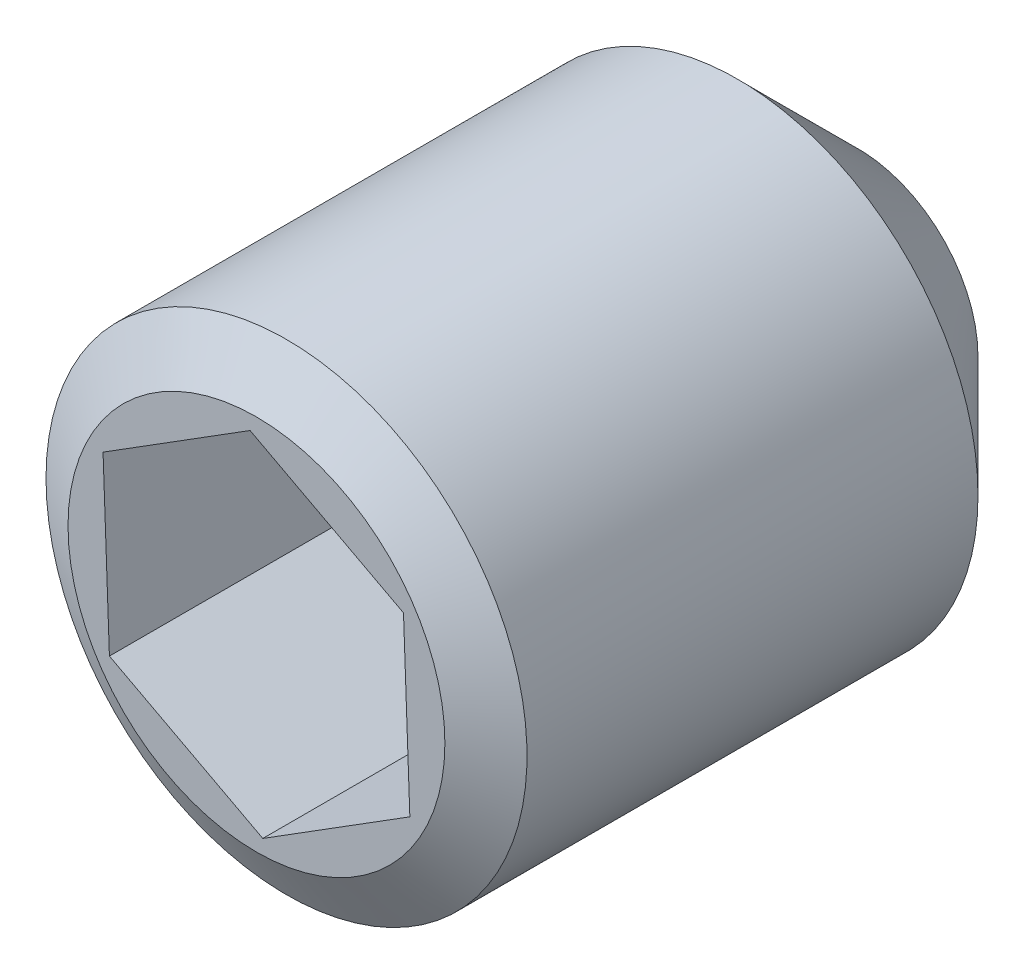
ISO-10303-21;
HEADER;
FILE_DESCRIPTION(('STEP AP214'),'2;1');
FILE_NAME('part.step','',(''),(''),'','','');
FILE_SCHEMA(('AUTOMOTIVE_DESIGN { 1 0 10303 214 1 1 1 1 }'));
ENDSEC;
DATA;
#1=APPLICATION_CONTEXT('core data for automotive mechanical design processes');
#2=APPLICATION_PROTOCOL_DEFINITION('international standard','automotive_design',2000,#1);
#3=PRODUCT_CONTEXT('',#1,'mechanical');
#4=PRODUCT('Part','Part','',(#3));
#5=PRODUCT_RELATED_PRODUCT_CATEGORY('part','',(#4));
#6=PRODUCT_DEFINITION_FORMATION('','',#4);
#7=PRODUCT_DEFINITION_CONTEXT('part definition',#1,'design');
#8=PRODUCT_DEFINITION('design','',#6,#7);
#9=PRODUCT_DEFINITION_SHAPE('','',#8);
#10=(LENGTH_UNIT() NAMED_UNIT(*) SI_UNIT(.MILLI.,.METRE.));
#11=(NAMED_UNIT(*) PLANE_ANGLE_UNIT() SI_UNIT($,.RADIAN.));
#12=(NAMED_UNIT(*) SI_UNIT($,.STERADIAN.) SOLID_ANGLE_UNIT());
#13=UNCERTAINTY_MEASURE_WITH_UNIT(LENGTH_MEASURE(1.E-05),#10,'distance_accuracy_value','');
#14=(GEOMETRIC_REPRESENTATION_CONTEXT(3) GLOBAL_UNCERTAINTY_ASSIGNED_CONTEXT((#13)) GLOBAL_UNIT_ASSIGNED_CONTEXT((#10,
#11,#12)) REPRESENTATION_CONTEXT('',''));
#15=CARTESIAN_POINT('',(0.,0.,0.));
#16=DIRECTION('',(0.,0.,1.));
#17=DIRECTION('',(1.,0.,0.));
#18=AXIS2_PLACEMENT_3D('',#15,#16,#17);
#19=CARTESIAN_POINT('',(0.,0.,10.0000000000001));
#20=DIRECTION('',(0.,0.,-1.));
#21=DIRECTION('',(-1.,0.,0.));
#22=AXIS2_PLACEMENT_3D('',#19,#20,#21);
#23=CYLINDRICAL_SURFACE('',#22,4.);
#24=CARTESIAN_POINT('',(0.,0.,2.00000000000017));
#25=DIRECTION('',(0.,0.,1.));
#26=DIRECTION('',(1.,0.,0.));
#27=AXIS2_PLACEMENT_3D('',#24,#25,#26);
#28=CIRCLE('',#27,4.);
#29=CARTESIAN_POINT('',(-4.,0.,2.00000000000017));
#30=VERTEX_POINT('',#29);
#31=EDGE_CURVE('E58',#30,#30,#28,.T.);
#32=CARTESIAN_POINT('',(0.,0.,9.50000000000015));
#33=DIRECTION('',(0.,0.,1.));
#34=DIRECTION('',(1.,0.,0.));
#35=AXIS2_PLACEMENT_3D('',#32,#33,#34);
#36=CIRCLE('',#35,4.);
#37=CARTESIAN_POINT('',(-4.,0.,9.50000000000015));
#38=VERTEX_POINT('',#37);
#39=EDGE_CURVE('E160',#38,#38,#36,.F.);
#40=CARTESIAN_POINT('',(-4.,0.,2.00000000000017));
#41=CARTESIAN_POINT('',(-4.,0.,2.07812500000017));
#42=CARTESIAN_POINT('',(-4.,0.,2.15625000000017));
#43=CARTESIAN_POINT('',(-4.,0.,2.31250000000016));
#44=CARTESIAN_POINT('',(-4.,0.,2.39062500000016));
#45=CARTESIAN_POINT('',(-4.,0.,2.54687500000016));
#46=CARTESIAN_POINT('',(-4.,0.,2.62500000000016));
#47=CARTESIAN_POINT('',(-4.,0.,2.78125000000016));
#48=CARTESIAN_POINT('',(-4.,0.,2.85937500000016));
#49=CARTESIAN_POINT('',(-4.,0.,3.01562500000016));
#50=CARTESIAN_POINT('',(-4.,0.,3.09375000000016));
#51=CARTESIAN_POINT('',(-4.,0.,3.25000000000016));
#52=CARTESIAN_POINT('',(-4.,0.,3.32812500000016));
#53=CARTESIAN_POINT('',(-4.,0.,3.48437500000016));
#54=CARTESIAN_POINT('',(-4.,0.,3.56250000000016));
#55=CARTESIAN_POINT('',(-4.,0.,3.71875000000016));
#56=CARTESIAN_POINT('',(-4.,0.,3.79687500000016));
#57=CARTESIAN_POINT('',(-4.,0.,3.95312500000016));
#58=CARTESIAN_POINT('',(-4.,0.,4.03125000000016));
#59=CARTESIAN_POINT('',(-4.,0.,4.18750000000016));
#60=CARTESIAN_POINT('',(-4.,0.,4.26562500000016));
#61=CARTESIAN_POINT('',(-4.,0.,4.42187500000016));
#62=CARTESIAN_POINT('',(-4.,0.,4.50000000000016));
#63=CARTESIAN_POINT('',(-4.,0.,4.65625000000016));
#64=CARTESIAN_POINT('',(-4.,0.,4.73437500000016));
#65=CARTESIAN_POINT('',(-4.,0.,4.89062500000016));
#66=CARTESIAN_POINT('',(-4.,0.,4.96875000000016));
#67=CARTESIAN_POINT('',(-4.,0.,5.12500000000016));
#68=CARTESIAN_POINT('',(-4.,0.,5.20312500000016));
#69=CARTESIAN_POINT('',(-4.,0.,5.35937500000016));
#70=CARTESIAN_POINT('',(-4.,0.,5.43750000000016));
#71=CARTESIAN_POINT('',(-4.,0.,5.59375000000016));
#72=CARTESIAN_POINT('',(-4.,0.,5.67187500000016));
#73=CARTESIAN_POINT('',(-4.,0.,5.82812500000016));
#74=CARTESIAN_POINT('',(-4.,0.,5.90625000000016));
#75=CARTESIAN_POINT('',(-4.,0.,6.06250000000016));
#76=CARTESIAN_POINT('',(-4.,0.,6.14062500000016));
#77=CARTESIAN_POINT('',(-4.,0.,6.29687500000015));
#78=CARTESIAN_POINT('',(-4.,0.,6.37500000000015));
#79=CARTESIAN_POINT('',(-4.,0.,6.53125000000015));
#80=CARTESIAN_POINT('',(-4.,0.,6.60937500000015));
#81=CARTESIAN_POINT('',(-4.,0.,6.76562500000015));
#82=CARTESIAN_POINT('',(-4.,0.,6.84375000000015));
#83=CARTESIAN_POINT('',(-4.,0.,7.00000000000015));
#84=CARTESIAN_POINT('',(-4.,0.,7.07812500000015));
#85=CARTESIAN_POINT('',(-4.,0.,7.23437500000015));
#86=CARTESIAN_POINT('',(-4.,0.,7.31250000000015));
#87=CARTESIAN_POINT('',(-4.,0.,7.46875000000015));
#88=CARTESIAN_POINT('',(-4.,0.,7.54687500000015));
#89=CARTESIAN_POINT('',(-4.,0.,7.70312500000015));
#90=CARTESIAN_POINT('',(-4.,0.,7.78125000000015));
#91=CARTESIAN_POINT('',(-4.,0.,7.93750000000015));
#92=CARTESIAN_POINT('',(-4.,0.,8.01562500000015));
#93=CARTESIAN_POINT('',(-4.,0.,8.17187500000015));
#94=CARTESIAN_POINT('',(-4.,0.,8.25000000000015));
#95=CARTESIAN_POINT('',(-4.,0.,8.40625000000015));
#96=CARTESIAN_POINT('',(-4.,0.,8.48437500000015));
#97=CARTESIAN_POINT('',(-4.,0.,8.64062500000015));
#98=CARTESIAN_POINT('',(-4.,0.,8.71875000000015));
#99=CARTESIAN_POINT('',(-4.,0.,8.87500000000015));
#100=CARTESIAN_POINT('',(-4.,0.,8.95312500000015));
#101=CARTESIAN_POINT('',(-4.,0.,9.10937500000015));
#102=CARTESIAN_POINT('',(-4.,0.,9.18750000000015));
#103=CARTESIAN_POINT('',(-4.,0.,9.34375000000015));
#104=CARTESIAN_POINT('',(-4.,0.,9.42187500000015));
#105=CARTESIAN_POINT('',(-4.,0.,9.50000000000015));
#106=B_SPLINE_CURVE_WITH_KNOTS('',3,(#40,#41,#42,#43,#44,#45,#46,#47,#48,#49,#50,#51,#52,#53,
#54,#55,#56,#57,#58,#59,#60,#61,#62,#63,#64,#65,#66,#67,#68,#69,#70,#71,#72,#73,#74,#75,#76,#77,
#78,#79,#80,#81,#82,#83,#84,#85,#86,#87,#88,#89,#90,#91,#92,#93,#94,#95,#96,#97,#98,#99,#100,
#101,#102,#103,#104,#105),.UNSPECIFIED.,.F.,.F.,(4,2,2,2,2,2,2,2,2,2,2,2,2,2,2,2,2,2,2,2,2,2,2,
2,2,2,2,2,2,2,2,2,4),(0.,0.234374999999998,0.468749999999998,0.703124999999997,
0.937499999999996,1.171875,1.40625,1.640625,1.87499999999999,2.10937499999999,2.34374999999999,
2.57812499999999,2.81249999999999,3.04687499999999,3.28124999999999,3.51562499999999,
3.74999999999999,3.98437499999999,4.21874999999999,4.45312499999999,4.68749999999999,
4.92187499999999,5.15624999999999,5.39062499999999,5.62499999999998,5.85937499999998,
6.09374999999998,6.32812499999998,6.56249999999998,6.79687499999998,7.03124999999998,
7.26562499999998,7.49999999999998),.UNSPECIFIED.);
#107=EDGE_CURVE('BSEAM50',#30,#38,#106,.T.);
#108=ORIENTED_EDGE('',*,*,#31,.T.);
#109=ORIENTED_EDGE('',*,*,#39,.T.);
#110=ORIENTED_EDGE('',*,*,#107,.T.);
#111=ORIENTED_EDGE('',*,*,#107,.F.);
#112=EDGE_LOOP('',(#108,#110,#109,#111));
#113=FACE_BOUND('',#112,.T.);
#114=ADVANCED_FACE('F50',(#113),#23,.T.);
#115=CARTESIAN_POINT('',(0.,0.,10.0000000000001));
#116=DIRECTION('',(0.,0.,1.));
#117=DIRECTION('',(1.,0.,0.));
#118=AXIS2_PLACEMENT_3D('',#115,#116,#117);
#119=PLANE('',#118);
#120=CARTESIAN_POINT('',(0.,0.,10.0000000000001));
#121=DIRECTION('',(0.,0.,1.));
#122=DIRECTION('',(1.,0.,0.));
#123=AXIS2_PLACEMENT_3D('',#120,#121,#122);
#124=CIRCLE('',#123,3.13397459621556);
#125=CARTESIAN_POINT('',(-3.13397459621556,0.,10.0000000000001));
#126=VERTEX_POINT('',#125);
#127=EDGE_CURVE('E152',#126,#126,#124,.T.);
#128=ORIENTED_EDGE('',*,*,#127,.T.);
#129=EDGE_LOOP('',(#128));
#130=FACE_BOUND('',#129,.T.);
#131=DIRECTION('',(-0.883771583990481,0.4679185691239,0.));
#132=VECTOR('',#131,1.);
#133=CARTESIAN_POINT('',(2.44541082760738,1.53404668036994,10.0000000000001));
#134=LINE('',#133,#132);
#135=CARTESIAN_POINT('',(2.44541082760738,1.53404668036994,10.0000000000001));
#136=VERTEX_POINT('',#135);
#137=CARTESIAN_POINT('',(-0.10581798198786,2.88481123958247,10.0000000000001));
#138=VERTEX_POINT('',#137);
#139=EDGE_CURVE('E65',#136,#138,#134,.T.);
#140=ORIENTED_EDGE('',*,*,#139,.F.);
#141=DIRECTION('',(-0.0366564242314784,0.999327927440519,0.));
#142=VECTOR('',#141,1.);
#143=CARTESIAN_POINT('',(2.55122880959521,-1.35076455921256,10.0000000000001));
#144=LINE('',#143,#142);
#145=CARTESIAN_POINT('',(2.55122880959521,-1.35076455921256,10.0000000000001));
#146=VERTEX_POINT('',#145);
#147=EDGE_CURVE('E148',#146,#136,#144,.T.);
#148=ORIENTED_EDGE('',*,*,#147,.F.);
#149=DIRECTION('',(0.847115159759002,0.53140935831662,0.));
#150=VECTOR('',#149,1.);
#151=CARTESIAN_POINT('',(0.10581798198786,-2.88481123958251,10.0000000000001));
#152=LINE('',#151,#150);
#153=CARTESIAN_POINT('',(0.10581798198786,-2.88481123958251,10.0000000000001));
#154=VERTEX_POINT('',#153);
#155=EDGE_CURVE('E146',#154,#146,#152,.T.);
#156=ORIENTED_EDGE('',*,*,#155,.F.);
#157=DIRECTION('',(0.883771583990481,-0.4679185691239,0.));
#158=VECTOR('',#157,1.);
#159=CARTESIAN_POINT('',(-2.44541082760738,-1.53404668036992,10.));
#160=LINE('',#159,#158);
#161=CARTESIAN_POINT('',(-2.44541082760738,-1.53404668036992,10.));
#162=VERTEX_POINT('',#161);
#163=EDGE_CURVE('E113',#162,#154,#160,.T.);
#164=ORIENTED_EDGE('',*,*,#163,.F.);
#165=DIRECTION('',(0.0366564242314788,-0.999327927440519,0.));
#166=VECTOR('',#165,1.);
#167=CARTESIAN_POINT('',(-2.55122880959527,1.35076455921251,10.));
#168=LINE('',#167,#166);
#169=CARTESIAN_POINT('',(-2.55122880959527,1.35076455921251,10.));
#170=VERTEX_POINT('',#169);
#171=EDGE_CURVE('E142',#170,#162,#168,.T.);
#172=ORIENTED_EDGE('',*,*,#171,.F.);
#173=DIRECTION('',(-0.847115159759002,-0.53140935831662,0.));
#174=VECTOR('',#173,1.);
#175=CARTESIAN_POINT('',(-0.10581798198786,2.88481123958247,10.0000000000001));
#176=LINE('',#175,#174);
#177=EDGE_CURVE('E139',#138,#170,#176,.T.);
#178=ORIENTED_EDGE('',*,*,#177,.F.);
#179=EDGE_LOOP('',(#140,#148,#156,#164,#172,#178));
#180=FACE_BOUND('',#179,.T.);
#181=ADVANCED_FACE('F176',(#130,#180),#119,.T.);
#182=CARTESIAN_POINT('',(0.,0.,0.));
#183=DIRECTION('',(0.,0.,1.));
#184=DIRECTION('',(1.,0.,0.));
#185=AXIS2_PLACEMENT_3D('',#182,#183,#184);
#186=PLANE('',#185);
#187=CARTESIAN_POINT('',(0.,0.,0.));
#188=DIRECTION('',(0.,0.,1.));
#189=DIRECTION('',(1.,0.,0.));
#190=AXIS2_PLACEMENT_3D('',#187,#188,#189);
#191=CIRCLE('',#190,1.99999999999999);
#192=CARTESIAN_POINT('',(1.99999999999999,0.,0.));
#193=VERTEX_POINT('',#192);
#194=EDGE_CURVE('E13',#193,#193,#191,.F.);
#195=ORIENTED_EDGE('',*,*,#194,.T.);
#196=EDGE_LOOP('',(#195));
#197=FACE_BOUND('',#196,.T.);
#198=ADVANCED_FACE('F181',(#197),#186,.F.);
#199=CARTESIAN_POINT('',(2.44541082760738,1.53404668036991,4.0000000000002));
#200=DIRECTION('',(0.467918569123899,0.883771583990481,0.));
#201=DIRECTION('',(-0.883771583990481,0.4679185691239,0.));
#202=AXIS2_PLACEMENT_3D('',#199,#200,#201);
#203=PLANE('',#202);
#204=ORIENTED_EDGE('',*,*,#139,.T.);
#205=DIRECTION('',(0.,0.,1.));
#206=VECTOR('',#205,1.);
#207=CARTESIAN_POINT('',(-0.10581798198786,2.88481123958245,4.));
#208=LINE('',#207,#206);
#209=CARTESIAN_POINT('',(-0.10581798198786,2.88481123958245,4.));
#210=VERTEX_POINT('',#209);
#211=EDGE_CURVE('E95',#210,#138,#208,.T.);
#212=ORIENTED_EDGE('',*,*,#211,.F.);
#213=DIRECTION('',(-0.883771583990481,0.4679185691239,0.));
#214=VECTOR('',#213,1.);
#215=CARTESIAN_POINT('',(2.44541082760738,1.53404668036991,4.0000000000002));
#216=LINE('',#215,#214);
#217=CARTESIAN_POINT('',(2.44541082760738,1.53404668036991,4.0000000000002));
#218=VERTEX_POINT('',#217);
#219=EDGE_CURVE('E150',#218,#210,#216,.T.);
#220=ORIENTED_EDGE('',*,*,#219,.F.);
#221=DIRECTION('',(0.,0.,1.));
#222=VECTOR('',#221,1.);
#223=CARTESIAN_POINT('',(2.44541082760738,1.53404668036991,4.0000000000002));
#224=LINE('',#223,#222);
#225=EDGE_CURVE('E73',#218,#136,#224,.T.);
#226=ORIENTED_EDGE('',*,*,#225,.T.);
#227=EDGE_LOOP('',(#204,#212,#220,#226));
#228=FACE_BOUND('',#227,.T.);
#229=ADVANCED_FACE('F186',(#228),#203,.F.);
#230=CARTESIAN_POINT('',(2.55122880959521,-1.35076455921256,4.00000000000017));
#231=DIRECTION('',(0.999327927440519,0.0366564242314789,0.));
#232=DIRECTION('',(-0.0366564242314784,0.999327927440519,0.));
#233=AXIS2_PLACEMENT_3D('',#230,#231,#232);
#234=PLANE('',#233);
#235=ORIENTED_EDGE('',*,*,#147,.T.);
#236=ORIENTED_EDGE('',*,*,#225,.F.);
#237=DIRECTION('',(-0.0366564242314784,0.999327927440519,0.));
#238=VECTOR('',#237,1.);
#239=CARTESIAN_POINT('',(2.55122880959521,-1.35076455921256,4.00000000000017));
#240=LINE('',#239,#238);
#241=CARTESIAN_POINT('',(2.55122880959521,-1.35076455921256,4.00000000000017));
#242=VERTEX_POINT('',#241);
#243=EDGE_CURVE('E125',#242,#218,#240,.T.);
#244=ORIENTED_EDGE('',*,*,#243,.F.);
#245=DIRECTION('',(0.,0.,1.));
#246=VECTOR('',#245,1.);
#247=CARTESIAN_POINT('',(2.55122880959521,-1.35076455921256,4.00000000000017));
#248=LINE('',#247,#246);
#249=EDGE_CURVE('E117',#242,#146,#248,.T.);
#250=ORIENTED_EDGE('',*,*,#249,.T.);
#251=EDGE_LOOP('',(#235,#236,#244,#250));
#252=FACE_BOUND('',#251,.T.);
#253=ADVANCED_FACE('F191',(#252),#234,.F.);
#254=CARTESIAN_POINT('',(0.10581798198786,-2.88481123958247,4.));
#255=DIRECTION('',(0.531409358316619,-0.847115159759002,0.));
#256=DIRECTION('',(0.847115159759002,0.53140935831662,0.));
#257=AXIS2_PLACEMENT_3D('',#254,#255,#256);
#258=PLANE('',#257);
#259=ORIENTED_EDGE('',*,*,#155,.T.);
#260=ORIENTED_EDGE('',*,*,#249,.F.);
#261=DIRECTION('',(0.847115159759002,0.53140935831662,0.));
#262=VECTOR('',#261,1.);
#263=CARTESIAN_POINT('',(0.10581798198786,-2.88481123958247,4.));
#264=LINE('',#263,#262);
#265=CARTESIAN_POINT('',(0.10581798198786,-2.88481123958247,4.));
#266=VERTEX_POINT('',#265);
#267=EDGE_CURVE('E121',#266,#242,#264,.T.);
#268=ORIENTED_EDGE('',*,*,#267,.F.);
#269=DIRECTION('',(0.,0.,1.));
#270=VECTOR('',#269,1.);
#271=CARTESIAN_POINT('',(0.10581798198786,-2.88481123958247,4.));
#272=LINE('',#271,#270);
#273=EDGE_CURVE('E106',#266,#154,#272,.T.);
#274=ORIENTED_EDGE('',*,*,#273,.T.);
#275=EDGE_LOOP('',(#259,#260,#268,#274));
#276=FACE_BOUND('',#275,.T.);
#277=ADVANCED_FACE('F122',(#276),#258,.F.);
#278=CARTESIAN_POINT('',(-2.44541082760738,-1.53404668036992,4.00000000000009));
#279=DIRECTION('',(-0.4679185691239,-0.883771583990481,0.));
#280=DIRECTION('',(0.883771583990481,-0.4679185691239,0.));
#281=AXIS2_PLACEMENT_3D('',#278,#279,#280);
#282=PLANE('',#281);
#283=ORIENTED_EDGE('',*,*,#163,.T.);
#284=ORIENTED_EDGE('',*,*,#273,.F.);
#285=DIRECTION('',(0.883771583990481,-0.4679185691239,0.));
#286=VECTOR('',#285,1.);
#287=CARTESIAN_POINT('',(-2.44541082760738,-1.53404668036992,4.00000000000009));
#288=LINE('',#287,#286);
#289=CARTESIAN_POINT('',(-2.44541082760738,-1.53404668036992,4.00000000000009));
#290=VERTEX_POINT('',#289);
#291=EDGE_CURVE('E110',#290,#266,#288,.T.);
#292=ORIENTED_EDGE('',*,*,#291,.F.);
#293=DIRECTION('',(0.,0.,1.));
#294=VECTOR('',#293,1.);
#295=CARTESIAN_POINT('',(-2.44541082760738,-1.53404668036992,4.00000000000009));
#296=LINE('',#295,#294);
#297=EDGE_CURVE('E118',#290,#162,#296,.T.);
#298=ORIENTED_EDGE('',*,*,#297,.T.);
#299=EDGE_LOOP('',(#283,#284,#292,#298));
#300=FACE_BOUND('',#299,.T.);
#301=ADVANCED_FACE('F108',(#300),#282,.F.);
#302=CARTESIAN_POINT('',(-2.55122880959527,1.3507645592125,4.00000000000017));
#303=DIRECTION('',(-0.999327927440518,-0.0366564242314787,0.));
#304=DIRECTION('',(0.0366564242314788,-0.999327927440519,0.));
#305=AXIS2_PLACEMENT_3D('',#302,#303,#304);
#306=PLANE('',#305);
#307=ORIENTED_EDGE('',*,*,#171,.T.);
#308=ORIENTED_EDGE('',*,*,#297,.F.);
#309=DIRECTION('',(0.0366564242314788,-0.999327927440519,0.));
#310=VECTOR('',#309,1.);
#311=CARTESIAN_POINT('',(-2.55122880959527,1.3507645592125,4.00000000000017));
#312=LINE('',#311,#310);
#313=CARTESIAN_POINT('',(-2.55122880959527,1.3507645592125,4.00000000000017));
#314=VERTEX_POINT('',#313);
#315=EDGE_CURVE('E131',#314,#290,#312,.T.);
#316=ORIENTED_EDGE('',*,*,#315,.F.);
#317=DIRECTION('',(0.,0.,1.));
#318=VECTOR('',#317,1.);
#319=CARTESIAN_POINT('',(-2.55122880959527,1.3507645592125,4.00000000000017));
#320=LINE('',#319,#318);
#321=EDGE_CURVE('E155',#314,#170,#320,.T.);
#322=ORIENTED_EDGE('',*,*,#321,.T.);
#323=EDGE_LOOP('',(#307,#308,#316,#322));
#324=FACE_BOUND('',#323,.T.);
#325=ADVANCED_FACE('F195',(#324),#306,.F.);
#326=CARTESIAN_POINT('',(-0.10581798198786,2.88481123958245,4.));
#327=DIRECTION('',(-0.531409358316619,0.847115159759002,0.));
#328=DIRECTION('',(-0.847115159759002,-0.53140935831662,0.));
#329=AXIS2_PLACEMENT_3D('',#326,#327,#328);
#330=PLANE('',#329);
#331=ORIENTED_EDGE('',*,*,#177,.T.);
#332=ORIENTED_EDGE('',*,*,#321,.F.);
#333=DIRECTION('',(-0.847115159759002,-0.53140935831662,0.));
#334=VECTOR('',#333,1.);
#335=CARTESIAN_POINT('',(-0.10581798198786,2.88481123958245,4.));
#336=LINE('',#335,#334);
#337=EDGE_CURVE('E133',#210,#314,#336,.T.);
#338=ORIENTED_EDGE('',*,*,#337,.F.);
#339=ORIENTED_EDGE('',*,*,#211,.T.);
#340=EDGE_LOOP('',(#331,#332,#338,#339));
#341=FACE_BOUND('',#340,.T.);
#342=ADVANCED_FACE('F192',(#341),#330,.F.);
#343=CARTESIAN_POINT('',(0.,0.,4.));
#344=DIRECTION('',(0.,0.,1.));
#345=DIRECTION('',(1.,0.,0.));
#346=AXIS2_PLACEMENT_3D('',#343,#344,#345);
#347=PLANE('',#346);
#348=ORIENTED_EDGE('',*,*,#219,.T.);
#349=ORIENTED_EDGE('',*,*,#337,.T.);
#350=ORIENTED_EDGE('',*,*,#315,.T.);
#351=ORIENTED_EDGE('',*,*,#291,.T.);
#352=ORIENTED_EDGE('',*,*,#267,.T.);
#353=ORIENTED_EDGE('',*,*,#243,.T.);
#354=EDGE_LOOP('',(#348,#349,#350,#351,#352,#353));
#355=FACE_BOUND('',#354,.T.);
#356=ADVANCED_FACE('F128',(#355),#347,.T.);
#357=CARTESIAN_POINT('',(0.,0.,10.0000000000001));
#358=DIRECTION('',(0.,0.,-1.));
#359=DIRECTION('',(-1.,0.,0.));
#360=AXIS2_PLACEMENT_3D('',#357,#358,#359);
#361=CONICAL_SURFACE('',#360,3.13397459621556,1.04719755119659);
#362=CARTESIAN_POINT('',(-3.99999999999985,0.,9.50000000000015));
#363=CARTESIAN_POINT('',(-3.99097890204376,0.,9.50520833333348));
#364=CARTESIAN_POINT('',(-3.98195780408768,0.,9.51041666666681));
#365=CARTESIAN_POINT('',(-3.9639156081755,0.,9.52083333333348));
#366=CARTESIAN_POINT('',(-3.95489451021942,0.,9.52604166666681));
#367=CARTESIAN_POINT('',(-3.93685231430724,0.,9.53645833333347));
#368=CARTESIAN_POINT('',(-3.92783121635116,0.,9.54166666666681));
#369=CARTESIAN_POINT('',(-3.90978902043899,0.,9.55208333333347));
#370=CARTESIAN_POINT('',(-3.9007679224829,0.,9.5572916666668));
#371=CARTESIAN_POINT('',(-3.88272572657073,0.,9.56770833333347));
#372=CARTESIAN_POINT('',(-3.87370462861464,0.,9.5729166666668));
#373=CARTESIAN_POINT('',(-3.85566243270247,0.,9.58333333333347));
#374=CARTESIAN_POINT('',(-3.84664133474638,0.,9.5885416666668));
#375=CARTESIAN_POINT('',(-3.82859913883421,0.,9.59895833333346));
#376=CARTESIAN_POINT('',(-3.81957804087812,0.,9.6041666666668));
#377=CARTESIAN_POINT('',(-3.80153584496595,0.,9.61458333333346));
#378=CARTESIAN_POINT('',(-3.79251474700986,0.,9.61979166666679));
#379=CARTESIAN_POINT('',(-3.77447255109769,0.,9.63020833333346));
#380=CARTESIAN_POINT('',(-3.7654514531416,0.,9.63541666666679));
#381=CARTESIAN_POINT('',(-3.74740925722943,0.,9.64583333333346));
#382=CARTESIAN_POINT('',(-3.73838815927335,0.,9.65104166666679));
#383=CARTESIAN_POINT('',(-3.72034596336117,0.,9.66145833333345));
#384=CARTESIAN_POINT('',(-3.71132486540509,0.,9.66666666666679));
#385=CARTESIAN_POINT('',(-3.69328266949291,0.,9.67708333333345));
#386=CARTESIAN_POINT('',(-3.68426157153683,0.,9.68229166666678));
#387=CARTESIAN_POINT('',(-3.66621937562465,0.,9.69270833333345));
#388=CARTESIAN_POINT('',(-3.65719827766857,0.,9.69791666666678));
#389=CARTESIAN_POINT('',(-3.6391560817564,0.,9.70833333333345));
#390=CARTESIAN_POINT('',(-3.63013498380031,0.,9.71354166666678));
#391=CARTESIAN_POINT('',(-3.61209278788814,0.,9.72395833333344));
#392=CARTESIAN_POINT('',(-3.60307168993205,0.,9.72916666666677));
#393=CARTESIAN_POINT('',(-3.58502949401988,0.,9.73958333333344));
#394=CARTESIAN_POINT('',(-3.57600839606379,0.,9.74479166666677));
#395=CARTESIAN_POINT('',(-3.55796620015162,0.,9.75520833333344));
#396=CARTESIAN_POINT('',(-3.54894510219553,0.,9.76041666666677));
#397=CARTESIAN_POINT('',(-3.53090290628336,0.,9.77083333333344));
#398=CARTESIAN_POINT('',(-3.52188180832727,0.,9.77604166666677));
#399=CARTESIAN_POINT('',(-3.5038396124151,0.,9.78645833333343));
#400=CARTESIAN_POINT('',(-3.49481851445901,0.,9.79166666666676));
#401=CARTESIAN_POINT('',(-3.47677631854684,0.,9.80208333333343));
#402=CARTESIAN_POINT('',(-3.46775522059076,0.,9.80729166666676));
#403=CARTESIAN_POINT('',(-3.44971302467858,0.,9.81770833333343));
#404=CARTESIAN_POINT('',(-3.4406919267225,0.,9.82291666666676));
#405=CARTESIAN_POINT('',(-3.42264973081032,0.,9.83333333333342));
#406=CARTESIAN_POINT('',(-3.41362863285424,0.,9.83854166666676));
#407=CARTESIAN_POINT('',(-3.39558643694207,0.,9.84895833333342));
#408=CARTESIAN_POINT('',(-3.38656533898598,0.,9.85416666666675));
#409=CARTESIAN_POINT('',(-3.36852314307381,0.,9.86458333333342));
#410=CARTESIAN_POINT('',(-3.35950204511772,0.,9.86979166666675));
#411=CARTESIAN_POINT('',(-3.34145984920555,0.,9.88020833333342));
#412=CARTESIAN_POINT('',(-3.33243875124946,0.,9.88541666666675));
#413=CARTESIAN_POINT('',(-3.31439655533729,0.,9.89583333333341));
#414=CARTESIAN_POINT('',(-3.3053754573812,0.,9.90104166666675));
#415=CARTESIAN_POINT('',(-3.28733326146903,0.,9.91145833333341));
#416=CARTESIAN_POINT('',(-3.27831216351294,0.,9.91666666666674));
#417=CARTESIAN_POINT('',(-3.26026996760077,0.,9.92708333333341));
#418=CARTESIAN_POINT('',(-3.25124886964468,0.,9.93229166666674));
#419=CARTESIAN_POINT('',(-3.23320667373251,0.,9.94270833333341));
#420=CARTESIAN_POINT('',(-3.22418557577643,0.,9.94791666666674));
#421=CARTESIAN_POINT('',(-3.20614337986425,0.,9.9583333333334));
#422=CARTESIAN_POINT('',(-3.19712228190817,0.,9.96354166666674));
#423=CARTESIAN_POINT('',(-3.17908008599599,0.,9.9739583333334));
#424=CARTESIAN_POINT('',(-3.17005898803991,0.,9.97916666666673));
#425=CARTESIAN_POINT('',(-3.15201679212773,0.,9.9895833333334));
#426=CARTESIAN_POINT('',(-3.14299569417165,0.,9.99479166666673));
#427=CARTESIAN_POINT('',(-3.13397459621556,0.,10.0000000000001));
#428=B_SPLINE_CURVE_WITH_KNOTS('',3,(#362,#363,#364,#365,#366,#367,#368,#369,#370,#371,#372,
#373,#374,#375,#376,#377,#378,#379,#380,#381,#382,#383,#384,#385,#386,#387,#388,#389,#390,#391,
#392,#393,#394,#395,#396,#397,#398,#399,#400,#401,#402,#403,#404,#405,#406,#407,#408,#409,#410,
#411,#412,#413,#414,#415,#416,#417,#418,#419,#420,#421,#422,#423,#424,#425,#426,#427),
.UNSPECIFIED.,.F.,.F.,(4,2,2,2,2,2,2,2,2,2,2,2,2,2,2,2,2,2,2,2,2,2,2,2,2,2,2,2,2,2,2,2,4),(0.,
0.0312499999999955,0.0624999999999894,0.0937499999999849,0.124999999999979,0.156249999999973,
0.187499999999968,0.218749999999963,0.249999999999957,0.281249999999952,0.312499999999946,
0.343749999999941,0.374999999999935,0.40624999999993,0.437499999999925,0.46874999999992,
0.499999999999914,0.531249999999909,0.562499999999903,0.593749999999898,0.624999999999892,
0.656249999999887,0.687499999999881,0.718749999999877,0.749999999999871,0.781249999999865,
0.81249999999986,0.843749999999855,0.87499999999985,0.906249999999844,0.937499999999839,
0.968749999999833,0.999999999999828),.UNSPECIFIED.);
#429=EDGE_CURVE('BSEAM168',#38,#126,#428,.T.);
#430=ORIENTED_EDGE('',*,*,#39,.F.);
#431=ORIENTED_EDGE('',*,*,#127,.F.);
#432=ORIENTED_EDGE('',*,*,#429,.T.);
#433=ORIENTED_EDGE('',*,*,#429,.F.);
#434=EDGE_LOOP('',(#430,#432,#431,#433));
#435=FACE_BOUND('',#434,.T.);
#436=ADVANCED_FACE('F168',(#435),#361,.T.);
#437=CARTESIAN_POINT('',(0.,0.,2.00000000000017));
#438=DIRECTION('',(0.,0.,1.));
#439=DIRECTION('',(1.,0.,0.));
#440=AXIS2_PLACEMENT_3D('',#437,#438,#439);
#441=CONICAL_SURFACE('',#440,4.,0.78539816339745);
#442=ORIENTED_EDGE('',*,*,#194,.F.);
#443=EDGE_LOOP('',(#442));
#444=FACE_BOUND('',#443,.T.);
#445=ORIENTED_EDGE('',*,*,#31,.F.);
#446=EDGE_LOOP('',(#445));
#447=FACE_BOUND('',#446,.T.);
#448=ADVANCED_FACE('F52',(#444,#447),#441,.T.);
#449=CLOSED_SHELL('',(#114,#181,#198,#229,#253,#277,#301,#325,#342,#356,#436,#448));
#450=MANIFOLD_SOLID_BREP('B2',#449);
#451=ADVANCED_BREP_SHAPE_REPRESENTATION('',(#18,#450),#14);
#452=SHAPE_DEFINITION_REPRESENTATION(#9,#451);
ENDSEC;
END-ISO-10303-21;
